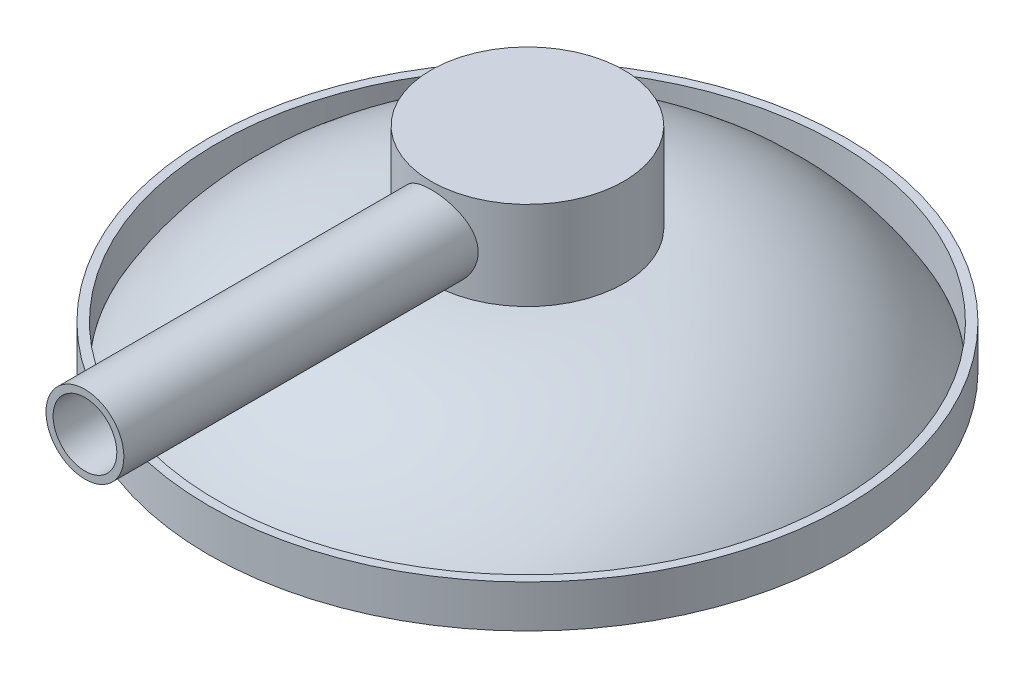
ISO-10303-21;
HEADER;
FILE_DESCRIPTION(('STEP AP214'),'2;1');
FILE_NAME('part.step','',(''),(''),'','','');
FILE_SCHEMA(('AUTOMOTIVE_DESIGN { 1 0 10303 214 1 1 1 1 }'));
ENDSEC;
DATA;
#1=APPLICATION_CONTEXT('core data for automotive mechanical design processes');
#2=APPLICATION_PROTOCOL_DEFINITION('international standard','automotive_design',2000,#1);
#3=PRODUCT_CONTEXT('',#1,'mechanical');
#4=PRODUCT('Part','Part','',(#3));
#5=PRODUCT_RELATED_PRODUCT_CATEGORY('part','',(#4));
#6=PRODUCT_DEFINITION_FORMATION('','',#4);
#7=PRODUCT_DEFINITION_CONTEXT('part definition',#1,'design');
#8=PRODUCT_DEFINITION('design','',#6,#7);
#9=PRODUCT_DEFINITION_SHAPE('','',#8);
#10=(LENGTH_UNIT() NAMED_UNIT(*) SI_UNIT(.MILLI.,.METRE.));
#11=(NAMED_UNIT(*) PLANE_ANGLE_UNIT() SI_UNIT($,.RADIAN.));
#12=(NAMED_UNIT(*) SI_UNIT($,.STERADIAN.) SOLID_ANGLE_UNIT());
#13=UNCERTAINTY_MEASURE_WITH_UNIT(LENGTH_MEASURE(1.E-05),#10,'distance_accuracy_value','');
#14=(GEOMETRIC_REPRESENTATION_CONTEXT(3) GLOBAL_UNCERTAINTY_ASSIGNED_CONTEXT((#13)) GLOBAL_UNIT_ASSIGNED_CONTEXT((#10,
#11,#12)) REPRESENTATION_CONTEXT('',''));
#15=CARTESIAN_POINT('',(0.,0.,0.));
#16=DIRECTION('',(0.,0.,1.));
#17=DIRECTION('',(1.,0.,0.));
#18=AXIS2_PLACEMENT_3D('',#15,#16,#17);
#19=CARTESIAN_POINT('',(0.,3.048,0.));
#20=DIRECTION('',(0.,-1.,0.));
#21=DIRECTION('',(0.,0.,-1.));
#22=AXIS2_PLACEMENT_3D('',#19,#20,#21);
#23=CYLINDRICAL_SURFACE('',#22,22.86);
#24=CARTESIAN_POINT('',(0.,3.048,0.));
#25=DIRECTION('',(0.,-1.,0.));
#26=DIRECTION('',(0.,0.,-1.));
#27=AXIS2_PLACEMENT_3D('',#24,#25,#26);
#28=CIRCLE('',#27,22.86);
#29=CARTESIAN_POINT('',(0.,3.048,-22.86));
#30=VERTEX_POINT('',#29);
#31=EDGE_CURVE('E11',#30,#30,#28,.T.);
#32=CARTESIAN_POINT('',(0.,0.,0.));
#33=DIRECTION('',(0.,-1.,0.));
#34=DIRECTION('',(0.,0.,-1.));
#35=AXIS2_PLACEMENT_3D('',#32,#33,#34);
#36=CIRCLE('',#35,22.86);
#37=CARTESIAN_POINT('',(0.,0.,-22.86));
#38=VERTEX_POINT('',#37);
#39=EDGE_CURVE('E49',#38,#38,#36,.T.);
#40=CARTESIAN_POINT('',(0.,3.048,-22.86));
#41=CARTESIAN_POINT('',(0.,3.01625,-22.86));
#42=CARTESIAN_POINT('',(0.,2.9845,-22.86));
#43=CARTESIAN_POINT('',(0.,2.921,-22.86));
#44=CARTESIAN_POINT('',(0.,2.88925,-22.86));
#45=CARTESIAN_POINT('',(0.,2.82575,-22.86));
#46=CARTESIAN_POINT('',(0.,2.794,-22.86));
#47=CARTESIAN_POINT('',(0.,2.7305,-22.86));
#48=CARTESIAN_POINT('',(0.,2.69875,-22.86));
#49=CARTESIAN_POINT('',(0.,2.63525,-22.86));
#50=CARTESIAN_POINT('',(0.,2.6035,-22.86));
#51=CARTESIAN_POINT('',(0.,2.54,-22.86));
#52=CARTESIAN_POINT('',(0.,2.50825,-22.86));
#53=CARTESIAN_POINT('',(0.,2.44475,-22.86));
#54=CARTESIAN_POINT('',(0.,2.413,-22.86));
#55=CARTESIAN_POINT('',(0.,2.3495,-22.86));
#56=CARTESIAN_POINT('',(0.,2.31775,-22.86));
#57=CARTESIAN_POINT('',(0.,2.25425,-22.86));
#58=CARTESIAN_POINT('',(0.,2.2225,-22.86));
#59=CARTESIAN_POINT('',(0.,2.159,-22.86));
#60=CARTESIAN_POINT('',(0.,2.12725,-22.86));
#61=CARTESIAN_POINT('',(0.,2.06375,-22.86));
#62=CARTESIAN_POINT('',(0.,2.032,-22.86));
#63=CARTESIAN_POINT('',(0.,1.9685,-22.86));
#64=CARTESIAN_POINT('',(0.,1.93675,-22.86));
#65=CARTESIAN_POINT('',(0.,1.87325,-22.86));
#66=CARTESIAN_POINT('',(0.,1.8415,-22.86));
#67=CARTESIAN_POINT('',(0.,1.778,-22.86));
#68=CARTESIAN_POINT('',(0.,1.74625,-22.86));
#69=CARTESIAN_POINT('',(0.,1.68275,-22.86));
#70=CARTESIAN_POINT('',(0.,1.651,-22.86));
#71=CARTESIAN_POINT('',(0.,1.5875,-22.86));
#72=CARTESIAN_POINT('',(0.,1.55575,-22.86));
#73=CARTESIAN_POINT('',(0.,1.49225,-22.86));
#74=CARTESIAN_POINT('',(0.,1.4605,-22.86));
#75=CARTESIAN_POINT('',(0.,1.397,-22.86));
#76=CARTESIAN_POINT('',(0.,1.36525,-22.86));
#77=CARTESIAN_POINT('',(0.,1.30175,-22.86));
#78=CARTESIAN_POINT('',(0.,1.27,-22.86));
#79=CARTESIAN_POINT('',(0.,1.2065,-22.86));
#80=CARTESIAN_POINT('',(0.,1.17475,-22.86));
#81=CARTESIAN_POINT('',(0.,1.11125,-22.86));
#82=CARTESIAN_POINT('',(0.,1.0795,-22.86));
#83=CARTESIAN_POINT('',(0.,1.016,-22.86));
#84=CARTESIAN_POINT('',(0.,0.98425,-22.86));
#85=CARTESIAN_POINT('',(0.,0.92075,-22.86));
#86=CARTESIAN_POINT('',(0.,0.889,-22.86));
#87=CARTESIAN_POINT('',(0.,0.8255,-22.86));
#88=CARTESIAN_POINT('',(0.,0.79375,-22.86));
#89=CARTESIAN_POINT('',(0.,0.73025,-22.86));
#90=CARTESIAN_POINT('',(0.,0.6985,-22.86));
#91=CARTESIAN_POINT('',(0.,0.635,-22.86));
#92=CARTESIAN_POINT('',(0.,0.60325,-22.86));
#93=CARTESIAN_POINT('',(0.,0.53975,-22.86));
#94=CARTESIAN_POINT('',(0.,0.508,-22.86));
#95=CARTESIAN_POINT('',(0.,0.4445,-22.86));
#96=CARTESIAN_POINT('',(0.,0.41275,-22.86));
#97=CARTESIAN_POINT('',(0.,0.34925,-22.86));
#98=CARTESIAN_POINT('',(0.,0.3175,-22.86));
#99=CARTESIAN_POINT('',(0.,0.254,-22.86));
#100=CARTESIAN_POINT('',(0.,0.22225,-22.86));
#101=CARTESIAN_POINT('',(0.,0.15875,-22.86));
#102=CARTESIAN_POINT('',(0.,0.127,-22.86));
#103=CARTESIAN_POINT('',(0.,0.0634999999999999,-22.86));
#104=CARTESIAN_POINT('',(0.,0.03175,-22.86));
#105=CARTESIAN_POINT('',(0.,0.,-22.86));
#106=B_SPLINE_CURVE_WITH_KNOTS('',3,(#40,#41,#42,#43,#44,#45,#46,#47,#48,#49,#50,#51,#52,#53,
#54,#55,#56,#57,#58,#59,#60,#61,#62,#63,#64,#65,#66,#67,#68,#69,#70,#71,#72,#73,#74,#75,#76,#77,
#78,#79,#80,#81,#82,#83,#84,#85,#86,#87,#88,#89,#90,#91,#92,#93,#94,#95,#96,#97,#98,#99,#100,
#101,#102,#103,#104,#105),.UNSPECIFIED.,.F.,.F.,(4,2,2,2,2,2,2,2,2,2,2,2,2,2,2,2,2,2,2,2,2,2,2,
2,2,2,2,2,2,2,2,2,4),(0.,0.0952500000000003,0.1905,0.28575,0.381,0.47625,0.5715,0.66675,
0.762000000000001,0.85725,0.9525,1.04775,1.143,1.23825,1.3335,1.42875,1.524,1.61925,1.7145,
1.80975,1.905,2.00025,2.0955,2.19075,2.286,2.38125,2.4765,2.57175,2.667,2.76225,2.8575,2.95275,
3.048),.UNSPECIFIED.);
#107=EDGE_CURVE('BSEAM46',#30,#38,#106,.T.);
#108=ORIENTED_EDGE('',*,*,#31,.T.);
#109=ORIENTED_EDGE('',*,*,#39,.F.);
#110=ORIENTED_EDGE('',*,*,#107,.T.);
#111=ORIENTED_EDGE('',*,*,#107,.F.);
#112=EDGE_LOOP('',(#108,#110,#109,#111));
#113=FACE_BOUND('',#112,.T.);
#114=ADVANCED_FACE('F46',(#113),#23,.T.);
#115=CARTESIAN_POINT('',(0.,3.048,0.));
#116=DIRECTION('',(0.,-1.,0.));
#117=DIRECTION('',(0.,0.,-1.));
#118=AXIS2_PLACEMENT_3D('',#115,#116,#117);
#119=PLANE('',#118);
#120=CARTESIAN_POINT('',(0.,3.048,0.));
#121=DIRECTION('',(0.,-1.,0.));
#122=DIRECTION('',(0.,0.,-1.));
#123=AXIS2_PLACEMENT_3D('',#120,#121,#122);
#124=CIRCLE('',#123,22.225);
#125=CARTESIAN_POINT('',(0.,3.048,-22.225));
#126=VERTEX_POINT('',#125);
#127=EDGE_CURVE('E56',#126,#126,#124,.T.);
#128=ORIENTED_EDGE('',*,*,#127,.T.);
#129=EDGE_LOOP('',(#128));
#130=FACE_BOUND('',#129,.T.);
#131=ORIENTED_EDGE('',*,*,#31,.F.);
#132=EDGE_LOOP('',(#131));
#133=FACE_BOUND('',#132,.T.);
#134=ADVANCED_FACE('F64',(#130,#133),#119,.F.);
#135=CARTESIAN_POINT('',(0.,0.,0.));
#136=DIRECTION('',(0.,-1.,0.));
#137=DIRECTION('',(0.,0.,-1.));
#138=AXIS2_PLACEMENT_3D('',#135,#136,#137);
#139=PLANE('',#138);
#140=CARTESIAN_POINT('',(0.,0.,0.));
#141=DIRECTION('',(0.,-1.,0.));
#142=DIRECTION('',(0.,0.,-1.));
#143=AXIS2_PLACEMENT_3D('',#140,#141,#142);
#144=CIRCLE('',#143,22.225);
#145=CARTESIAN_POINT('',(0.,0.,-22.225));
#146=VERTEX_POINT('',#145);
#147=EDGE_CURVE('E58',#146,#146,#144,.T.);
#148=ORIENTED_EDGE('',*,*,#147,.F.);
#149=EDGE_LOOP('',(#148));
#150=FACE_BOUND('',#149,.T.);
#151=ORIENTED_EDGE('',*,*,#39,.T.);
#152=EDGE_LOOP('',(#151));
#153=FACE_BOUND('',#152,.T.);
#154=ADVANCED_FACE('F70',(#150,#153),#139,.T.);
#155=CARTESIAN_POINT('',(0.,3.048,0.));
#156=DIRECTION('',(0.,-1.,0.));
#157=DIRECTION('',(0.,0.,-1.));
#158=AXIS2_PLACEMENT_3D('',#155,#156,#157);
#159=CYLINDRICAL_SURFACE('',#158,22.225);
#160=CARTESIAN_POINT('',(0.,3.048,-22.225));
#161=CARTESIAN_POINT('',(0.,3.01625,-22.225));
#162=CARTESIAN_POINT('',(0.,2.9845,-22.225));
#163=CARTESIAN_POINT('',(0.,2.921,-22.225));
#164=CARTESIAN_POINT('',(0.,2.88925,-22.225));
#165=CARTESIAN_POINT('',(0.,2.82575,-22.225));
#166=CARTESIAN_POINT('',(0.,2.794,-22.225));
#167=CARTESIAN_POINT('',(0.,2.7305,-22.225));
#168=CARTESIAN_POINT('',(0.,2.69875,-22.225));
#169=CARTESIAN_POINT('',(0.,2.63525,-22.225));
#170=CARTESIAN_POINT('',(0.,2.6035,-22.225));
#171=CARTESIAN_POINT('',(0.,2.54,-22.225));
#172=CARTESIAN_POINT('',(0.,2.50825,-22.225));
#173=CARTESIAN_POINT('',(0.,2.44475,-22.225));
#174=CARTESIAN_POINT('',(0.,2.413,-22.225));
#175=CARTESIAN_POINT('',(0.,2.3495,-22.225));
#176=CARTESIAN_POINT('',(0.,2.31775,-22.225));
#177=CARTESIAN_POINT('',(0.,2.25425,-22.225));
#178=CARTESIAN_POINT('',(0.,2.2225,-22.225));
#179=CARTESIAN_POINT('',(0.,2.159,-22.225));
#180=CARTESIAN_POINT('',(0.,2.12725,-22.225));
#181=CARTESIAN_POINT('',(0.,2.06375,-22.225));
#182=CARTESIAN_POINT('',(0.,2.032,-22.225));
#183=CARTESIAN_POINT('',(0.,1.9685,-22.225));
#184=CARTESIAN_POINT('',(0.,1.93675,-22.225));
#185=CARTESIAN_POINT('',(0.,1.87325,-22.225));
#186=CARTESIAN_POINT('',(0.,1.8415,-22.225));
#187=CARTESIAN_POINT('',(0.,1.778,-22.225));
#188=CARTESIAN_POINT('',(0.,1.74625,-22.225));
#189=CARTESIAN_POINT('',(0.,1.68275,-22.225));
#190=CARTESIAN_POINT('',(0.,1.651,-22.225));
#191=CARTESIAN_POINT('',(0.,1.5875,-22.225));
#192=CARTESIAN_POINT('',(0.,1.55575,-22.225));
#193=CARTESIAN_POINT('',(0.,1.49225,-22.225));
#194=CARTESIAN_POINT('',(0.,1.4605,-22.225));
#195=CARTESIAN_POINT('',(0.,1.397,-22.225));
#196=CARTESIAN_POINT('',(0.,1.36525,-22.225));
#197=CARTESIAN_POINT('',(0.,1.30175,-22.225));
#198=CARTESIAN_POINT('',(0.,1.27,-22.225));
#199=CARTESIAN_POINT('',(0.,1.2065,-22.225));
#200=CARTESIAN_POINT('',(0.,1.17475,-22.225));
#201=CARTESIAN_POINT('',(0.,1.11125,-22.225));
#202=CARTESIAN_POINT('',(0.,1.0795,-22.225));
#203=CARTESIAN_POINT('',(0.,1.016,-22.225));
#204=CARTESIAN_POINT('',(0.,0.98425,-22.225));
#205=CARTESIAN_POINT('',(0.,0.92075,-22.225));
#206=CARTESIAN_POINT('',(0.,0.889,-22.225));
#207=CARTESIAN_POINT('',(0.,0.8255,-22.225));
#208=CARTESIAN_POINT('',(0.,0.79375,-22.225));
#209=CARTESIAN_POINT('',(0.,0.73025,-22.225));
#210=CARTESIAN_POINT('',(0.,0.6985,-22.225));
#211=CARTESIAN_POINT('',(0.,0.635,-22.225));
#212=CARTESIAN_POINT('',(0.,0.60325,-22.225));
#213=CARTESIAN_POINT('',(0.,0.53975,-22.225));
#214=CARTESIAN_POINT('',(0.,0.508,-22.225));
#215=CARTESIAN_POINT('',(0.,0.4445,-22.225));
#216=CARTESIAN_POINT('',(0.,0.41275,-22.225));
#217=CARTESIAN_POINT('',(0.,0.34925,-22.225));
#218=CARTESIAN_POINT('',(0.,0.3175,-22.225));
#219=CARTESIAN_POINT('',(0.,0.254,-22.225));
#220=CARTESIAN_POINT('',(0.,0.22225,-22.225));
#221=CARTESIAN_POINT('',(0.,0.15875,-22.225));
#222=CARTESIAN_POINT('',(0.,0.127,-22.225));
#223=CARTESIAN_POINT('',(0.,0.0634999999999999,-22.225));
#224=CARTESIAN_POINT('',(0.,0.03175,-22.225));
#225=CARTESIAN_POINT('',(0.,0.,-22.225));
#226=B_SPLINE_CURVE_WITH_KNOTS('',3,(#160,#161,#162,#163,#164,#165,#166,#167,#168,#169,#170,
#171,#172,#173,#174,#175,#176,#177,#178,#179,#180,#181,#182,#183,#184,#185,#186,#187,#188,#189,
#190,#191,#192,#193,#194,#195,#196,#197,#198,#199,#200,#201,#202,#203,#204,#205,#206,#207,#208,
#209,#210,#211,#212,#213,#214,#215,#216,#217,#218,#219,#220,#221,#222,#223,#224,#225),
.UNSPECIFIED.,.F.,.F.,(4,2,2,2,2,2,2,2,2,2,2,2,2,2,2,2,2,2,2,2,2,2,2,2,2,2,2,2,2,2,2,2,4),(0.,
0.0952499999999998,0.1905,0.28575,0.381,0.47625,0.5715,0.66675,0.762,0.85725,0.9525,1.04775,
1.143,1.23825,1.3335,1.42875,1.524,1.61925,1.7145,1.80975,1.905,2.00025,2.0955,2.19075,2.286,
2.38125,2.4765,2.57175,2.667,2.76225,2.8575,2.95275,3.048),.UNSPECIFIED.);
#227=EDGE_CURVE('BSEAM67',#126,#146,#226,.T.);
#228=ORIENTED_EDGE('',*,*,#127,.F.);
#229=ORIENTED_EDGE('',*,*,#147,.T.);
#230=ORIENTED_EDGE('',*,*,#227,.T.);
#231=ORIENTED_EDGE('',*,*,#227,.F.);
#232=EDGE_LOOP('',(#228,#230,#229,#231));
#233=FACE_BOUND('',#232,.T.);
#234=ADVANCED_FACE('F67',(#233),#159,.F.);
#235=CLOSED_SHELL('',(#114,#134,#154,#234));
#236=MANIFOLD_SOLID_BREP('B2',#235);
#237=CARTESIAN_POINT('',(0.,15.24,0.));
#238=DIRECTION('',(0.,-1.,0.));
#239=DIRECTION('',(0.,0.,-1.));
#240=AXIS2_PLACEMENT_3D('',#237,#238,#239);
#241=CYLINDRICAL_SURFACE('',#240,6.91972313220045);
#242=CARTESIAN_POINT('',(0.,15.24,0.));
#243=DIRECTION('',(0.,1.,0.));
#244=DIRECTION('',(0.,0.,1.));
#245=AXIS2_PLACEMENT_3D('',#242,#243,#244);
#246=CIRCLE('',#245,6.91972313220045);
#247=CARTESIAN_POINT('',(0.,15.24,6.91972313220045));
#248=VERTEX_POINT('',#247);
#249=EDGE_CURVE('E128',#248,#248,#246,.T.);
#250=ORIENTED_EDGE('',*,*,#249,.F.);
#251=EDGE_LOOP('',(#250));
#252=FACE_BOUND('',#251,.T.);
#253=CARTESIAN_POINT('',(0.,8.89,0.));
#254=DIRECTION('',(0.,1.,0.));
#255=DIRECTION('',(0.,0.,1.));
#256=AXIS2_PLACEMENT_3D('',#253,#254,#255);
#257=CIRCLE('',#256,6.91972313220045);
#258=CARTESIAN_POINT('',(0.,8.89,6.91972313220045));
#259=VERTEX_POINT('',#258);
#260=EDGE_CURVE('E120',#259,#259,#257,.T.);
#261=ORIENTED_EDGE('',*,*,#260,.T.);
#262=EDGE_LOOP('',(#261));
#263=FACE_BOUND('',#262,.T.);
#264=CARTESIAN_POINT('',(-2.794,11.938,6.33057124012596));
#265=CARTESIAN_POINT('',(-2.79399845025552,11.8632142974158,6.33057257853365));
#266=CARTESIAN_POINT('',(-2.79099103932768,11.7884024715349,6.33190254820811));
#267=CARTESIAN_POINT('',(-2.77900057310896,11.6393370501478,6.33717264824498));
#268=CARTESIAN_POINT('',(-2.77001369673238,11.5650838423227,6.34111444765045));
#269=CARTESIAN_POINT('',(-2.73414566195546,11.3436890240607,6.3567094825561));
#270=CARTESIAN_POINT('',(-2.69835742130989,11.1981420788068,6.37213179675973));
#271=CARTESIAN_POINT('',(-2.60471031695556,10.916263057411,6.41097212540434));
#272=CARTESIAN_POINT('',(-2.54693769632511,10.7798973932701,6.43435885883008));
#273=CARTESIAN_POINT('',(-2.41121407845989,10.5188026665018,6.48643848166101));
#274=CARTESIAN_POINT('',(-2.33326871333008,10.3940703691125,6.5151298893965));
#275=CARTESIAN_POINT('',(-2.15454620081422,10.1524669540081,6.57646328168034));
#276=CARTESIAN_POINT('',(-2.05277939010508,10.0363607233387,6.6092339604869));
#277=CARTESIAN_POINT('',(-1.83138367733722,9.82229920268202,6.67397160759741));
#278=CARTESIAN_POINT('',(-1.71174815851316,9.72435066671125,6.70593827303089));
#279=CARTESIAN_POINT('',(-1.45208797642082,9.54557481322559,6.76701386218961));
#280=CARTESIAN_POINT('',(-1.31143597329641,9.46559645606502,6.79595572433709));
#281=CARTESIAN_POINT('',(-1.01729633104335,9.33076282052112,6.8461584374737));
#282=CARTESIAN_POINT('',(-0.863814093287778,9.27589703241637,6.86742250086752));
#283=CARTESIAN_POINT('',(-0.556385030316956,9.19558238124043,6.89896294689068));
#284=CARTESIAN_POINT('',(-0.402832993013752,9.16881839117028,6.90972868209912));
#285=CARTESIAN_POINT('',(-0.093065089797343,9.14122894034436,6.92083016498663));
#286=CARTESIAN_POINT('',(0.063149742151793,9.14039363113466,6.92116987276832));
#287=CARTESIAN_POINT('',(0.364289801647656,9.16397139850774,6.91167664219506));
#288=CARTESIAN_POINT('',(0.509349579508329,9.18694259881581,6.90242462953182));
#289=CARTESIAN_POINT('',(0.793351644705535,9.25502450457534,6.87557386187139));
#290=CARTESIAN_POINT('',(0.932293482011945,9.30013683575333,6.85797449396755));
#291=CARTESIAN_POINT('',(1.20263123250506,9.41177122479451,6.81580969822038));
#292=CARTESIAN_POINT('',(1.33388122539295,9.47860678987843,6.79114293316414));
#293=CARTESIAN_POINT('',(1.58364287994236,9.63149380845778,6.73728365746261));
#294=CARTESIAN_POINT('',(1.70215012097184,9.71755189884906,6.70808958475617));
#295=CARTESIAN_POINT('',(1.93146144086622,9.9131324060017,6.64583116969203));
#296=CARTESIAN_POINT('',(2.04122342615209,10.0238375738984,6.61263856272564));
#297=CARTESIAN_POINT('',(2.24105653624215,10.2622010990304,6.54761794130768));
#298=CARTESIAN_POINT('',(2.33112096574936,10.3898651970631,6.51579039379252));
#299=CARTESIAN_POINT('',(2.49145001043918,10.6632686794055,6.45622138181022));
#300=CARTESIAN_POINT('',(2.56105841782608,10.8094275443882,6.4286266675027));
#301=CARTESIAN_POINT('',(2.67425736579628,11.1128036112969,6.38237413215362));
#302=CARTESIAN_POINT('',(2.71786518531748,11.2700133913911,6.36371037758995));
#303=CARTESIAN_POINT('',(2.77526438691429,11.5806216907503,6.33888004082081));
#304=CARTESIAN_POINT('',(2.79073588892821,11.7336527529945,6.3320107406475));
#305=CARTESIAN_POINT('',(2.79633124998268,12.0402453560373,6.32954341687288));
#306=CARTESIAN_POINT('',(2.78646302690385,12.19380671616,6.33394187244526));
#307=CARTESIAN_POINT('',(2.74318963423213,12.487651219714,6.35279216960012));
#308=CARTESIAN_POINT('',(2.71119519424427,12.6281856045876,6.36664081549553));
#309=CARTESIAN_POINT('',(2.62641643518561,12.9017932641718,6.40207779740628));
#310=CARTESIAN_POINT('',(2.57362745058014,13.0348648568455,6.42366787021681));
#311=CARTESIAN_POINT('',(2.44634618363669,13.2958537034911,6.47323654526546));
#312=CARTESIAN_POINT('',(2.37105315294304,13.423336258475,6.50144069164574));
#313=CARTESIAN_POINT('',(2.2017147176037,13.6644448698179,6.56072095560798));
#314=CARTESIAN_POINT('',(2.10766156664798,13.7780651709247,6.59179825670147));
#315=CARTESIAN_POINT('',(1.89508866610452,13.9971471218555,6.65615726291644));
#316=CARTESIAN_POINT('',(1.77525747475329,14.1013442903716,6.68942816966699));
#317=CARTESIAN_POINT('',(1.51902105866927,14.2883540761527,6.75222358328401));
#318=CARTESIAN_POINT('',(1.38261504143395,14.3711656703038,6.78174791087485));
#319=CARTESIAN_POINT('',(1.09651806213989,14.5127923015114,6.8338377153065));
#320=CARTESIAN_POINT('',(0.946822519157983,14.5715990246376,6.85640078050001));
#321=CARTESIAN_POINT('',(0.638525916315829,14.662797598951,6.89194251285868));
#322=CARTESIAN_POINT('',(0.479929850273051,14.6952041072239,6.90492649783696));
#323=CARTESIAN_POINT('',(0.169675596272436,14.7309192890493,6.91926953478621));
#324=CARTESIAN_POINT('',(0.018254536815371,14.7360146484706,6.92134222563457));
#325=CARTESIAN_POINT('',(-0.28321537650677,14.7217001199805,6.91556742438268));
#326=CARTESIAN_POINT('',(-0.433264442130036,14.7022940802715,6.90772149010661));
#327=CARTESIAN_POINT('',(-0.722839348670266,14.6408065893433,6.88335232027889));
#328=CARTESIAN_POINT('',(-0.862548053864971,14.5994649031422,6.86711259733002));
#329=CARTESIAN_POINT('',(-1.133016339857,14.4960625424263,6.82770378202901));
#330=CARTESIAN_POINT('',(-1.26377416399462,14.4339978148684,6.80453333424781));
#331=CARTESIAN_POINT('',(-1.51902217733459,14.2878075850314,6.75224911790921));
#332=CARTESIAN_POINT('',(-1.64297487475524,14.202823606348,6.72291683099337));
#333=CARTESIAN_POINT('',(-1.87537702226299,14.0144831020081,6.66183093848696));
#334=CARTESIAN_POINT('',(-1.98382115120152,13.9111202975466,6.63007650753688));
#335=CARTESIAN_POINT('',(-2.18922267464955,13.6812676592548,6.56522653884664));
#336=CARTESIAN_POINT('',(-2.28502237172673,13.5537296190244,6.53217292782016));
#337=CARTESIAN_POINT('',(-2.45401953571382,13.2832205239521,6.47058657746292));
#338=CARTESIAN_POINT('',(-2.52720474702382,13.1402411573425,6.44205629354868));
#339=CARTESIAN_POINT('',(-2.61777159736818,12.91783394248,6.40553483327907));
#340=CARTESIAN_POINT('',(-2.64469288605176,12.8426733506941,6.39443686987996));
#341=CARTESIAN_POINT('',(-2.692068735533,12.6900461203945,6.37463703145988));
#342=CARTESIAN_POINT('',(-2.71252640892563,12.6125806115536,6.36593400340392));
#343=CARTESIAN_POINT('',(-2.74669884916695,12.4561488649372,6.35126429225383));
#344=CARTESIAN_POINT('',(-2.76043164455154,12.3771872357026,6.34529029589804));
#345=CARTESIAN_POINT('',(-2.78106218261891,12.2182501665044,6.33627581673074));
#346=CARTESIAN_POINT('',(-2.7879649903634,12.13827552243,6.33323316010633));
#347=CARTESIAN_POINT('',(-2.79313881451265,12.0181290781718,6.33095119560009));
#348=CARTESIAN_POINT('',(-2.79400083031391,11.9780682884914,6.33057052304096));
#349=CARTESIAN_POINT('',(-2.794,11.938,6.33057124012596));
#350=B_SPLINE_CURVE_WITH_KNOTS('',3,(#264,#265,#266,#267,#268,#269,#270,#271,#272,#273,#274,
#275,#276,#277,#278,#279,#280,#281,#282,#283,#284,#285,#286,#287,#288,#289,#290,#291,#292,#293,
#294,#295,#296,#297,#298,#299,#300,#301,#302,#303,#304,#305,#306,#307,#308,#309,#310,#311,#312,
#313,#314,#315,#316,#317,#318,#319,#320,#321,#322,#323,#324,#325,#326,#327,#328,#329,#330,#331,
#332,#333,#334,#335,#336,#337,#338,#339,#340,#341,#342,#343,#344,#345,#346,#347,#348,#349),
.UNSPECIFIED.,.T.,.F.,(4,2,2,2,2,2,2,2,2,2,2,2,2,2,2,2,2,2,2,2,2,2,2,2,2,2,2,2,2,2,2,2,2,2,2,2,
2,2,2,2,2,2,4),(0.,0.224322199151926,0.448787885820797,0.898399554489224,1.34626531576495,
1.7940061703405,2.2654320596699,2.7370329523459,3.22763743829572,3.71803641593747,
4.18429500994652,4.65037650344974,5.08979069377773,5.52923715319849,5.97533035552856,
6.42157781767178,6.89761023175816,7.37380420101454,7.86392698592566,8.35372369098611,
8.81317047134414,9.27247370625968,9.70490683309587,10.1374370374086,10.5876923032309,
11.0381338719178,11.5225987056141,12.0070867124528,12.491742376466,12.9761287816823,
13.4284013762084,13.8806029454013,14.3184422310623,14.7563672001907,15.2137712406377,
15.6713318464839,16.1577845586862,16.6445004365494,16.8860434158681,17.1274699007198,
17.3682455596564,17.6088425272496,17.7290286895782),.UNSPECIFIED.);
#351=CARTESIAN_POINT('',(-2.794,11.938,6.33057124012596));
#352=VERTEX_POINT('',#351);
#353=EDGE_CURVE('E45',#352,#352,#350,.T.);
#354=ORIENTED_EDGE('',*,*,#353,.F.);
#355=EDGE_LOOP('',(#354));
#356=FACE_BOUND('',#355,.T.);
#357=ADVANCED_FACE('F108',(#252,#263,#356),#241,.T.);
#358=CARTESIAN_POINT('',(0.,0.,0.));
#359=DIRECTION('',(0.,1.,0.));
#360=DIRECTION('',(0.,0.,1.));
#361=AXIS2_PLACEMENT_3D('',#358,#359,#360);
#362=PLANE('',#361);
#363=CARTESIAN_POINT('',(0.,0.,0.));
#364=DIRECTION('',(0.,1.,0.));
#365=DIRECTION('',(0.,0.,1.));
#366=AXIS2_PLACEMENT_3D('',#363,#364,#365);
#367=CIRCLE('',#366,22.225);
#368=CARTESIAN_POINT('',(0.,0.,22.225));
#369=VERTEX_POINT('',#368);
#370=EDGE_CURVE('E124',#369,#369,#367,.T.);
#371=ORIENTED_EDGE('',*,*,#370,.F.);
#372=EDGE_LOOP('',(#371));
#373=FACE_BOUND('',#372,.T.);
#374=ADVANCED_FACE('F185',(#373),#362,.F.);
#375=CARTESIAN_POINT('',(0.,-8.73,0.));
#376=DIRECTION('',(0.,-1.,0.));
#377=DIRECTION('',(0.,0.,-1.));
#378=AXIS2_PLACEMENT_3D('',#375,#376,#377);
#379=DEGENERATE_TOROIDAL_SURFACE('',#378,6.91972313220045,17.62,.T.);
#380=ORIENTED_EDGE('',*,*,#370,.T.);
#381=EDGE_LOOP('',(#380));
#382=FACE_BOUND('',#381,.T.);
#383=ORIENTED_EDGE('',*,*,#260,.F.);
#384=EDGE_LOOP('',(#383));
#385=FACE_BOUND('',#384,.T.);
#386=ADVANCED_FACE('F110',(#382,#385),#379,.T.);
#387=CARTESIAN_POINT('',(0.,15.24,0.));
#388=DIRECTION('',(0.,1.,0.));
#389=DIRECTION('',(0.,0.,1.));
#390=AXIS2_PLACEMENT_3D('',#387,#388,#389);
#391=PLANE('',#390);
#392=ORIENTED_EDGE('',*,*,#249,.T.);
#393=EDGE_LOOP('',(#392));
#394=FACE_BOUND('',#393,.T.);
#395=ADVANCED_FACE('F179',(#394),#391,.T.);
#396=CARTESIAN_POINT('',(0.,11.938,31.75));
#397=DIRECTION('',(0.,0.,-1.));
#398=DIRECTION('',(-1.,0.,0.));
#399=AXIS2_PLACEMENT_3D('',#396,#397,#398);
#400=CYLINDRICAL_SURFACE('',#399,2.794);
#401=CARTESIAN_POINT('',(0.,11.938,31.75));
#402=DIRECTION('',(0.,0.,1.));
#403=DIRECTION('',(1.,0.,0.));
#404=AXIS2_PLACEMENT_3D('',#401,#402,#403);
#405=CIRCLE('',#404,2.794);
#406=CARTESIAN_POINT('',(2.794,11.938,31.75));
#407=VERTEX_POINT('',#406);
#408=EDGE_CURVE('E133',#407,#407,#405,.T.);
#409=ORIENTED_EDGE('',*,*,#408,.F.);
#410=EDGE_LOOP('',(#409));
#411=FACE_BOUND('',#410,.T.);
#412=ORIENTED_EDGE('',*,*,#353,.T.);
#413=EDGE_LOOP('',(#412));
#414=FACE_BOUND('',#413,.T.);
#415=ADVANCED_FACE('F174',(#411,#414),#400,.T.);
#416=CARTESIAN_POINT('',(0.,11.938,31.75));
#417=DIRECTION('',(0.,0.,1.));
#418=DIRECTION('',(1.,0.,0.));
#419=AXIS2_PLACEMENT_3D('',#416,#417,#418);
#420=PLANE('',#419);
#421=CARTESIAN_POINT('',(0.,11.938,31.75));
#422=DIRECTION('',(0.,0.,1.));
#423=DIRECTION('',(1.,0.,0.));
#424=AXIS2_PLACEMENT_3D('',#421,#422,#423);
#425=CIRCLE('',#424,2.286);
#426=CARTESIAN_POINT('',(2.286,11.938,31.75));
#427=VERTEX_POINT('',#426);
#428=EDGE_CURVE('E137',#427,#427,#425,.T.);
#429=ORIENTED_EDGE('',*,*,#428,.F.);
#430=EDGE_LOOP('',(#429));
#431=FACE_BOUND('',#430,.T.);
#432=ORIENTED_EDGE('',*,*,#408,.T.);
#433=EDGE_LOOP('',(#432));
#434=FACE_BOUND('',#433,.T.);
#435=ADVANCED_FACE('F172',(#431,#434),#420,.T.);
#436=CARTESIAN_POINT('',(0.,15.24,0.));
#437=DIRECTION('',(0.,-1.,0.));
#438=DIRECTION('',(0.,0.,-1.));
#439=AXIS2_PLACEMENT_3D('',#436,#437,#438);
#440=CYLINDRICAL_SURFACE('',#439,6.41172313220045);
#441=CARTESIAN_POINT('',(0.,14.732,0.));
#442=DIRECTION('',(0.,1.,0.));
#443=DIRECTION('',(0.,0.,1.));
#444=AXIS2_PLACEMENT_3D('',#441,#442,#443);
#445=CIRCLE('',#444,6.41172313220045);
#446=CARTESIAN_POINT('',(0.,14.732,6.41172313220045));
#447=VERTEX_POINT('',#446);
#448=EDGE_CURVE('E140',#447,#447,#445,.T.);
#449=ORIENTED_EDGE('',*,*,#448,.T.);
#450=EDGE_LOOP('',(#449));
#451=FACE_BOUND('',#450,.T.);
#452=CARTESIAN_POINT('',(0.,8.37445789845442,0.));
#453=DIRECTION('',(0.,-1.,0.));
#454=DIRECTION('',(0.,0.,-1.));
#455=AXIS2_PLACEMENT_3D('',#452,#453,#454);
#456=CIRCLE('',#455,6.41172313220045);
#457=CARTESIAN_POINT('',(0.,8.37445789845442,-6.41172313220045));
#458=VERTEX_POINT('',#457);
#459=EDGE_CURVE('E144',#458,#458,#456,.F.);
#460=ORIENTED_EDGE('',*,*,#459,.F.);
#461=EDGE_LOOP('',(#460));
#462=FACE_BOUND('',#461,.T.);
#463=CARTESIAN_POINT('',(2.2591886847263,12.2870880788636,6.00052164489047));
#464=CARTESIAN_POINT('',(2.23980569452701,12.4125333174468,6.007818651804));
#465=CARTESIAN_POINT('',(2.20997380386382,12.5361322354037,6.01897066134979));
#466=CARTESIAN_POINT('',(2.13059325787909,12.7760646846124,6.04752227004361));
#467=CARTESIAN_POINT('',(2.08103705293389,12.8923954141642,6.06492426116787));
#468=CARTESIAN_POINT('',(1.9640143085463,13.1145066365064,6.10381986812414));
#469=CARTESIAN_POINT('',(1.89659180864096,13.22031220309,6.12530338682853));
#470=CARTESIAN_POINT('',(1.74561919312775,13.4192874459663,6.17002390089257));
#471=CARTESIAN_POINT('',(1.66206676369992,13.5124553061259,6.19326114753086));
#472=CARTESIAN_POINT('',(1.47725017203833,13.6873823225608,6.23997959538362));
#473=CARTESIAN_POINT('',(1.37542156603825,13.7685535463416,6.26343485899929));
#474=CARTESIAN_POINT('',(1.15896853952426,13.9127126458723,6.30707192839164));
#475=CARTESIAN_POINT('',(1.04434484035163,13.9757015459589,6.3272539185465));
#476=CARTESIAN_POINT('',(0.806226151835964,14.0810366820691,6.36196048652195));
#477=CARTESIAN_POINT('',(0.682806780447501,14.1235390801349,6.37652768750497));
#478=CARTESIAN_POINT('',(0.429947108934021,14.186980374693,6.39854776844994));
#479=CARTESIAN_POINT('',(0.300509301249259,14.2079281160222,6.40600356644578));
#480=CARTESIAN_POINT('',(0.0467347375638989,14.2268714582434,6.41274218715881));
#481=CARTESIAN_POINT('',(-0.0775050155759634,14.2260336801856,6.41244043911061));
#482=CARTESIAN_POINT('',(-0.323979552720692,14.2043042675301,6.40471931796396));
#483=CARTESIAN_POINT('',(-0.446214515027595,14.1834144262674,6.39730058136585));
#484=CARTESIAN_POINT('',(-0.683028878617887,14.1229352136445,6.37632801111949));
#485=CARTESIAN_POINT('',(-0.797706203071827,14.083687577203,6.36288647807237));
#486=CARTESIAN_POINT('',(-1.01889160194713,13.9879239894167,6.33123604055165));
#487=CARTESIAN_POINT('',(-1.1253980747963,13.9314046634045,6.31302620451221));
#488=CARTESIAN_POINT('',(-1.33204675965776,13.8000037255824,6.27274981420113));
#489=CARTESIAN_POINT('',(-1.43174007237953,13.7244562051274,6.2505543597843));
#490=CARTESIAN_POINT('',(-1.61740686989633,13.55828518965,6.20510608164896));
#491=CARTESIAN_POINT('',(-1.70337551753257,13.4676564022272,6.18185288883203));
#492=CARTESIAN_POINT('',(-1.8631091131717,13.2690082910138,6.13565399835262));
#493=CARTESIAN_POINT('',(-1.93614775990945,13.1603885078747,6.11276959290884));
#494=CARTESIAN_POINT('',(-2.06289215402006,12.931658371127,6.07117286666038));
#495=CARTESIAN_POINT('',(-2.11660125658612,12.8115500162733,6.05245982201201));
#496=CARTESIAN_POINT('',(-2.20192872345317,12.5656128964898,6.02193759728928));
#497=CARTESIAN_POINT('',(-2.23397023015451,12.4399480697287,6.00999695746521));
#498=CARTESIAN_POINT('',(-2.27634577942297,12.1845394122889,5.9940783326498));
#499=CARTESIAN_POINT('',(-2.28669037512457,12.0547975957953,5.99009647663951));
#500=CARTESIAN_POINT('',(-2.2852807314793,11.8032366278912,5.99063205026809));
#501=CARTESIAN_POINT('',(-2.2748092802872,11.6814070343478,5.99465612703773));
#502=CARTESIAN_POINT('',(-2.23472275758338,11.4413965772088,6.00971369793096));
#503=CARTESIAN_POINT('',(-2.20510668317171,11.3232159051036,6.02074755926484));
#504=CARTESIAN_POINT('',(-2.12791671539485,11.0939858578377,6.04845632628393));
#505=CARTESIAN_POINT('',(-2.08039314662925,10.9829175092347,6.06511541016261));
#506=CARTESIAN_POINT('',(-1.96882516517399,10.7701093235322,6.10224277293666));
#507=CARTESIAN_POINT('',(-1.90477602788968,10.6683721654766,6.12271214071019));
#508=CARTESIAN_POINT('',(-1.75759850476147,10.4707966281357,6.16662486993357));
#509=CARTESIAN_POINT('',(-1.67357665357636,10.3756461703339,6.19017198330032));
#510=CARTESIAN_POINT('',(-1.49087519682457,10.2004404233891,6.2366948212423));
#511=CARTESIAN_POINT('',(-1.39219202293781,10.1203888198487,6.25967040512315));
#512=CARTESIAN_POINT('',(-1.17921984989215,9.97526202228415,6.3033158953083));
#513=CARTESIAN_POINT('',(-1.0645433891366,9.9107249137096,6.32389282820425));
#514=CARTESIAN_POINT('',(-0.82510747448168,9.80205474349988,6.3595607129682));
#515=CARTESIAN_POINT('',(-0.700351229201323,9.75791521869015,6.37465340224826));
#516=CARTESIAN_POINT('',(-0.449397481045373,9.6930098731326,6.39714665820521));
#517=CARTESIAN_POINT('',(-0.323441336962608,9.67140787410768,6.40482156159116));
#518=CARTESIAN_POINT('',(-0.0694735384165959,9.64950684597946,6.41260376519948));
#519=CARTESIAN_POINT('',(0.0585374927986571,9.64920147530108,6.41271331818385));
#520=CARTESIAN_POINT('',(0.306806175182874,9.66941545208121,6.40552873781008));
#521=CARTESIAN_POINT('',(0.427152124901335,9.68899077400454,6.39857022612266));
#522=CARTESIAN_POINT('',(0.662720438483833,9.74681082996235,6.37847762907515));
#523=CARTESIAN_POINT('',(0.777942469222503,9.78505677591427,6.36534314283218));
#524=CARTESIAN_POINT('',(1.00177965308646,9.87955678160116,6.3340019474809));
#525=CARTESIAN_POINT('',(1.1102892140734,9.93603889098438,6.31573140583305));
#526=CARTESIAN_POINT('',(1.31654191178274,10.0652127697523,6.2759827266259));
#527=CARTESIAN_POINT('',(1.41428179874676,10.1379094119829,6.25450362546173));
#528=CARTESIAN_POINT('',(1.60173979036001,10.3019824309605,6.2092202801626));
#529=CARTESIAN_POINT('',(1.69075341064356,10.3941474726632,6.18535312713916));
#530=CARTESIAN_POINT('',(1.85232008469555,10.5922480201095,6.13890767467575));
#531=CARTESIAN_POINT('',(1.92486946860936,10.6981865876915,6.11632966342132));
#532=CARTESIAN_POINT('',(2.05272083021733,10.9234919360988,6.07463222847145));
#533=CARTESIAN_POINT('',(2.10765970299887,11.0430799103064,6.05558865824657));
#534=CARTESIAN_POINT('',(2.19636200517612,11.2906551454657,6.02398795688042));
#535=CARTESIAN_POINT('',(2.23013732309482,11.4186376461146,6.01142718475971));
#536=CARTESIAN_POINT('',(2.27364333528744,11.6704576394545,5.99510171366371));
#537=CARTESIAN_POINT('',(2.28481074158924,11.7940132300178,5.99081232121882));
#538=CARTESIAN_POINT('',(2.28700843115177,12.0413241030695,5.98997411153437));
#539=CARTESIAN_POINT('',(2.27804068528903,12.1650793648288,5.99342453670304));
#540=CARTESIAN_POINT('',(2.2591886847263,12.2870880788636,6.00052164489047));
#541=B_SPLINE_CURVE_WITH_KNOTS('',3,(#463,#464,#465,#466,#467,#468,#469,#470,#471,#472,#473,
#474,#475,#476,#477,#478,#479,#480,#481,#482,#483,#484,#485,#486,#487,#488,#489,#490,#491,#492,
#493,#494,#495,#496,#497,#498,#499,#500,#501,#502,#503,#504,#505,#506,#507,#508,#509,#510,#511,
#512,#513,#514,#515,#516,#517,#518,#519,#520,#521,#522,#523,#524,#525,#526,#527,#528,#529,#530,
#531,#532,#533,#534,#535,#536,#537,#538,#539,#540),.UNSPECIFIED.,.T.,.F.,(4,2,2,2,2,2,2,2,2,2,2,
2,2,2,2,2,2,2,2,2,2,2,2,2,2,2,2,2,2,2,2,2,2,2,2,2,2,2,4),(0.,0.380953034348773,
0.762052021659084,1.14222021873264,1.52244299107693,1.91752059849589,2.31257594409979,
2.70457032054771,3.09640378000162,3.46729989293065,3.83816283825088,4.20238123423044,
4.56667083937655,4.94611082907727,5.32568425582467,5.72239647222856,6.11903979467276,
6.50769431462212,6.89615975348733,7.26142716277452,7.62671370831497,7.99098127067478,
8.35535309130939,8.74093144202084,9.12660379023683,9.52417173491639,9.9216136197694,
10.3037198327304,10.6857122640382,11.0503766989189,11.4150648074572,11.7845026016312,
12.1540515704417,12.543282568545,12.9326002406495,13.3294939676425,13.7261645411847,
14.0967177812536,14.4672347522719),.UNSPECIFIED.);
#542=CARTESIAN_POINT('',(2.2591886847263,12.2870880788636,6.00052164489047));
#543=VERTEX_POINT('',#542);
#544=EDGE_CURVE('E136',#543,#543,#541,.T.);
#545=ORIENTED_EDGE('',*,*,#544,.T.);
#546=EDGE_LOOP('',(#545));
#547=FACE_BOUND('',#546,.T.);
#548=ADVANCED_FACE('F153',(#451,#462,#547),#440,.F.);
#549=CARTESIAN_POINT('',(0.,0.508,0.));
#550=DIRECTION('',(0.,1.,0.));
#551=DIRECTION('',(0.,0.,1.));
#552=AXIS2_PLACEMENT_3D('',#549,#550,#551);
#553=PLANE('',#552);
#554=CARTESIAN_POINT('',(0.,0.508,0.));
#555=DIRECTION('',(0.,1.,0.));
#556=DIRECTION('',(0.,0.,1.));
#557=AXIS2_PLACEMENT_3D('',#554,#555,#556);
#558=CIRCLE('',#557,21.3238857250067);
#559=CARTESIAN_POINT('',(0.,0.508,21.3238857250067));
#560=VERTEX_POINT('',#559);
#561=EDGE_CURVE('E141',#560,#560,#558,.T.);
#562=ORIENTED_EDGE('',*,*,#561,.T.);
#563=EDGE_LOOP('',(#562));
#564=FACE_BOUND('',#563,.T.);
#565=ADVANCED_FACE('F161',(#564),#553,.T.);
#566=CARTESIAN_POINT('',(0.,-8.73,0.));
#567=DIRECTION('',(0.,-1.,0.));
#568=DIRECTION('',(0.,0.,-1.));
#569=AXIS2_PLACEMENT_3D('',#566,#567,#568);
#570=DEGENERATE_TOROIDAL_SURFACE('',#569,6.91972313220045,17.112,.T.);
#571=ORIENTED_EDGE('',*,*,#561,.F.);
#572=EDGE_LOOP('',(#571));
#573=FACE_BOUND('',#572,.T.);
#574=ORIENTED_EDGE('',*,*,#459,.T.);
#575=EDGE_LOOP('',(#574));
#576=FACE_BOUND('',#575,.T.);
#577=ADVANCED_FACE('F164',(#573,#576),#570,.F.);
#578=CARTESIAN_POINT('',(0.,14.732,0.));
#579=DIRECTION('',(0.,1.,0.));
#580=DIRECTION('',(0.,0.,1.));
#581=AXIS2_PLACEMENT_3D('',#578,#579,#580);
#582=PLANE('',#581);
#583=ORIENTED_EDGE('',*,*,#448,.F.);
#584=EDGE_LOOP('',(#583));
#585=FACE_BOUND('',#584,.T.);
#586=ADVANCED_FACE('F159',(#585),#582,.F.);
#587=CARTESIAN_POINT('',(0.,11.938,31.75));
#588=DIRECTION('',(0.,0.,-1.));
#589=DIRECTION('',(-1.,0.,0.));
#590=AXIS2_PLACEMENT_3D('',#587,#588,#589);
#591=CYLINDRICAL_SURFACE('',#590,2.286);
#592=ORIENTED_EDGE('',*,*,#428,.T.);
#593=EDGE_LOOP('',(#592));
#594=FACE_BOUND('',#593,.T.);
#595=ORIENTED_EDGE('',*,*,#544,.F.);
#596=EDGE_LOOP('',(#595));
#597=FACE_BOUND('',#596,.T.);
#598=ADVANCED_FACE('F155',(#594,#597),#591,.F.);
#599=CLOSED_SHELL('',(#357,#374,#386,#395,#415,#435,#548,#565,#577,#586,#598));
#600=MANIFOLD_SOLID_BREP('B6',#599);
#601=ADVANCED_BREP_SHAPE_REPRESENTATION('',(#18,#236,#600),#14);
#602=SHAPE_DEFINITION_REPRESENTATION(#9,#601);
ENDSEC;
END-ISO-10303-21;
